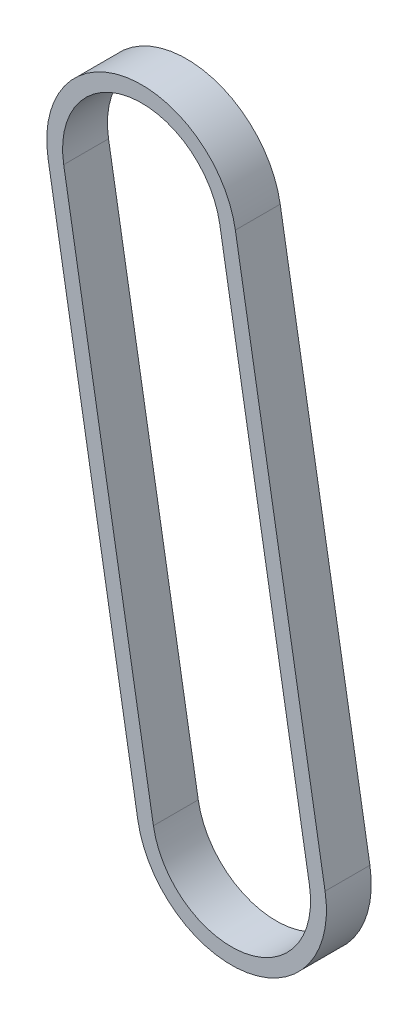
ISO-10303-21;
HEADER;
FILE_DESCRIPTION(('STEP AP214'),'2;1');
FILE_NAME('part.step','',(''),(''),'','','');
FILE_SCHEMA(('AUTOMOTIVE_DESIGN { 1 0 10303 214 1 1 1 1 }'));
ENDSEC;
DATA;
#1=APPLICATION_CONTEXT('core data for automotive mechanical design processes');
#2=APPLICATION_PROTOCOL_DEFINITION('international standard','automotive_design',2000,#1);
#3=PRODUCT_CONTEXT('',#1,'mechanical');
#4=PRODUCT('Part','Part','',(#3));
#5=PRODUCT_RELATED_PRODUCT_CATEGORY('part','',(#4));
#6=PRODUCT_DEFINITION_FORMATION('','',#4);
#7=PRODUCT_DEFINITION_CONTEXT('part definition',#1,'design');
#8=PRODUCT_DEFINITION('design','',#6,#7);
#9=PRODUCT_DEFINITION_SHAPE('','',#8);
#10=(LENGTH_UNIT() NAMED_UNIT(*) SI_UNIT(.MILLI.,.METRE.));
#11=(NAMED_UNIT(*) PLANE_ANGLE_UNIT() SI_UNIT($,.RADIAN.));
#12=(NAMED_UNIT(*) SI_UNIT($,.STERADIAN.) SOLID_ANGLE_UNIT());
#13=UNCERTAINTY_MEASURE_WITH_UNIT(LENGTH_MEASURE(1.E-05),#10,'distance_accuracy_value','');
#14=(GEOMETRIC_REPRESENTATION_CONTEXT(3) GLOBAL_UNCERTAINTY_ASSIGNED_CONTEXT((#13)) GLOBAL_UNIT_ASSIGNED_CONTEXT((#10,
#11,#12)) REPRESENTATION_CONTEXT('',''));
#15=CARTESIAN_POINT('',(0.,0.,0.));
#16=DIRECTION('',(0.,0.,1.));
#17=DIRECTION('',(1.,0.,0.));
#18=AXIS2_PLACEMENT_3D('',#15,#16,#17);
#19=CARTESIAN_POINT('',(-17.,62.590365959435,8.5));
#20=DIRECTION('',(0.,0.,1.));
#21=DIRECTION('',(1.,0.,0.));
#22=AXIS2_PLACEMENT_3D('',#19,#20,#21);
#23=PLANE('',#22);
#24=CARTESIAN_POINT('',(-17.,62.590365959435,8.5));
#25=DIRECTION('',(0.,0.,1.));
#26=DIRECTION('',(1.,0.,0.));
#27=AXIS2_PLACEMENT_3D('',#24,#25,#26);
#28=CIRCLE('',#27,18.);
#29=CARTESIAN_POINT('',(0.745405240056712,65.6070848502446,8.5));
#30=VERTEX_POINT('',#29);
#31=CARTESIAN_POINT('',(-34.7454052400567,59.5736470686253,8.5));
#32=VERTEX_POINT('',#31);
#33=EDGE_CURVE('E136',#30,#32,#28,.T.);
#34=ORIENTED_EDGE('',*,*,#33,.T.);
#35=DIRECTION('',(0.167595493933869,-0.985855846669817,0.));
#36=VECTOR('',#35,1.);
#37=CARTESIAN_POINT('',(-34.7454052400567,59.5736470686253,8.5));
#38=LINE('',#37,#36);
#39=CARTESIAN_POINT('',(-17.7454052400567,-40.4263529313747,8.5));
#40=VERTEX_POINT('',#39);
#41=EDGE_CURVE('E139',#32,#40,#38,.T.);
#42=ORIENTED_EDGE('',*,*,#41,.T.);
#43=CARTESIAN_POINT('',(0.,-37.409634040565,8.5));
#44=DIRECTION('',(0.,0.,1.));
#45=DIRECTION('',(1.,0.,0.));
#46=AXIS2_PLACEMENT_3D('',#43,#44,#45);
#47=CIRCLE('',#46,18.);
#48=CARTESIAN_POINT('',(17.7454052400567,-34.3929151497554,8.5));
#49=VERTEX_POINT('',#48);
#50=EDGE_CURVE('E142',#40,#49,#47,.T.);
#51=ORIENTED_EDGE('',*,*,#50,.T.);
#52=DIRECTION('',(-0.167595493933869,0.985855846669817,0.));
#53=VECTOR('',#52,1.);
#54=CARTESIAN_POINT('',(0.745405240056712,65.6070848502446,8.5));
#55=LINE('',#54,#53);
#56=EDGE_CURVE('E144',#49,#30,#55,.T.);
#57=ORIENTED_EDGE('',*,*,#56,.T.);
#58=EDGE_LOOP('',(#34,#42,#51,#57));
#59=FACE_BOUND('',#58,.T.);
#60=DIRECTION('',(0.167595493933869,-0.985855846669817,0.));
#61=VECTOR('',#60,1.);
#62=CARTESIAN_POINT('',(-31.7878377000473,60.076433550427,8.5));
#63=LINE('',#62,#61);
#64=CARTESIAN_POINT('',(-31.7878377000473,60.076433550427,8.5));
#65=VERTEX_POINT('',#64);
#66=CARTESIAN_POINT('',(-14.7878377000473,-39.9235664495731,8.5));
#67=VERTEX_POINT('',#66);
#68=EDGE_CURVE('E108',#65,#67,#63,.T.);
#69=ORIENTED_EDGE('',*,*,#68,.F.);
#70=CARTESIAN_POINT('',(-17.,62.590365959435,8.5));
#71=DIRECTION('',(0.,0.,1.));
#72=DIRECTION('',(1.,0.,0.));
#73=AXIS2_PLACEMENT_3D('',#70,#71,#72);
#74=CIRCLE('',#73,15.);
#75=CARTESIAN_POINT('',(-2.21216229995274,65.104298368443,8.5));
#76=VERTEX_POINT('',#75);
#77=EDGE_CURVE('E100',#76,#65,#74,.T.);
#78=ORIENTED_EDGE('',*,*,#77,.F.);
#79=DIRECTION('',(-0.167595493933869,0.985855846669817,0.));
#80=VECTOR('',#79,1.);
#81=CARTESIAN_POINT('',(-2.21216229995274,65.104298368443,8.5));
#82=LINE('',#81,#80);
#83=CARTESIAN_POINT('',(14.7878377000473,-34.895701631557,8.5));
#84=VERTEX_POINT('',#83);
#85=EDGE_CURVE('E122',#84,#76,#82,.T.);
#86=ORIENTED_EDGE('',*,*,#85,.F.);
#87=CARTESIAN_POINT('',(0.,-37.409634040565,8.5));
#88=DIRECTION('',(0.,0.,1.));
#89=DIRECTION('',(1.,0.,0.));
#90=AXIS2_PLACEMENT_3D('',#87,#88,#89);
#91=CIRCLE('',#90,15.);
#92=EDGE_CURVE('E120',#67,#84,#91,.T.);
#93=ORIENTED_EDGE('',*,*,#92,.F.);
#94=EDGE_LOOP('',(#69,#78,#86,#93));
#95=FACE_BOUND('',#94,.T.);
#96=ADVANCED_FACE('F35',(#59,#95),#23,.T.);
#97=CARTESIAN_POINT('',(-17.,62.590365959435,0.));
#98=DIRECTION('',(0.,0.,1.));
#99=DIRECTION('',(1.,0.,0.));
#100=AXIS2_PLACEMENT_3D('',#97,#98,#99);
#101=PLANE('',#100);
#102=CARTESIAN_POINT('',(-17.,62.590365959435,0.));
#103=DIRECTION('',(0.,0.,1.));
#104=DIRECTION('',(1.,0.,0.));
#105=AXIS2_PLACEMENT_3D('',#102,#103,#104);
#106=CIRCLE('',#105,18.);
#107=CARTESIAN_POINT('',(0.745405240056712,65.6070848502446,0.));
#108=VERTEX_POINT('',#107);
#109=CARTESIAN_POINT('',(-34.7454052400567,59.5736470686253,0.));
#110=VERTEX_POINT('',#109);
#111=EDGE_CURVE('E116',#108,#110,#106,.T.);
#112=ORIENTED_EDGE('',*,*,#111,.F.);
#113=DIRECTION('',(-0.167595493933869,0.985855846669817,0.));
#114=VECTOR('',#113,1.);
#115=CARTESIAN_POINT('',(0.745405240056712,65.6070848502446,0.));
#116=LINE('',#115,#114);
#117=CARTESIAN_POINT('',(17.7454052400567,-34.3929151497554,0.));
#118=VERTEX_POINT('',#117);
#119=EDGE_CURVE('E140',#118,#108,#116,.T.);
#120=ORIENTED_EDGE('',*,*,#119,.F.);
#121=CARTESIAN_POINT('',(0.,-37.409634040565,0.));
#122=DIRECTION('',(0.,0.,1.));
#123=DIRECTION('',(1.,0.,0.));
#124=AXIS2_PLACEMENT_3D('',#121,#122,#123);
#125=CIRCLE('',#124,18.);
#126=CARTESIAN_POINT('',(-17.7454052400567,-40.4263529313747,0.));
#127=VERTEX_POINT('',#126);
#128=EDGE_CURVE('E151',#127,#118,#125,.T.);
#129=ORIENTED_EDGE('',*,*,#128,.F.);
#130=DIRECTION('',(0.167595493933869,-0.985855846669817,0.));
#131=VECTOR('',#130,1.);
#132=CARTESIAN_POINT('',(-34.7454052400567,59.5736470686253,0.));
#133=LINE('',#132,#131);
#134=EDGE_CURVE('E149',#110,#127,#133,.T.);
#135=ORIENTED_EDGE('',*,*,#134,.F.);
#136=EDGE_LOOP('',(#112,#120,#129,#135));
#137=FACE_BOUND('',#136,.T.);
#138=CARTESIAN_POINT('',(-17.,62.590365959435,0.));
#139=DIRECTION('',(0.,0.,1.));
#140=DIRECTION('',(1.,0.,0.));
#141=AXIS2_PLACEMENT_3D('',#138,#139,#140);
#142=CIRCLE('',#141,15.);
#143=CARTESIAN_POINT('',(-2.21216229995274,65.104298368443,0.));
#144=VERTEX_POINT('',#143);
#145=CARTESIAN_POINT('',(-31.7878377000473,60.076433550427,0.));
#146=VERTEX_POINT('',#145);
#147=EDGE_CURVE('E58',#144,#146,#142,.T.);
#148=ORIENTED_EDGE('',*,*,#147,.T.);
#149=DIRECTION('',(0.167595493933869,-0.985855846669817,0.));
#150=VECTOR('',#149,1.);
#151=CARTESIAN_POINT('',(-31.7878377000473,60.076433550427,0.));
#152=LINE('',#151,#150);
#153=CARTESIAN_POINT('',(-14.7878377000473,-39.9235664495731,0.));
#154=VERTEX_POINT('',#153);
#155=EDGE_CURVE('E115',#146,#154,#152,.T.);
#156=ORIENTED_EDGE('',*,*,#155,.T.);
#157=CARTESIAN_POINT('',(0.,-37.409634040565,0.));
#158=DIRECTION('',(0.,0.,1.));
#159=DIRECTION('',(1.,0.,0.));
#160=AXIS2_PLACEMENT_3D('',#157,#158,#159);
#161=CIRCLE('',#160,15.);
#162=CARTESIAN_POINT('',(14.7878377000473,-34.895701631557,0.));
#163=VERTEX_POINT('',#162);
#164=EDGE_CURVE('E128',#154,#163,#161,.T.);
#165=ORIENTED_EDGE('',*,*,#164,.T.);
#166=DIRECTION('',(-0.167595493933869,0.985855846669817,0.));
#167=VECTOR('',#166,1.);
#168=CARTESIAN_POINT('',(-2.21216229995274,65.104298368443,0.));
#169=LINE('',#168,#167);
#170=EDGE_CURVE('E109',#163,#144,#169,.T.);
#171=ORIENTED_EDGE('',*,*,#170,.T.);
#172=EDGE_LOOP('',(#148,#156,#165,#171));
#173=FACE_BOUND('',#172,.T.);
#174=ADVANCED_FACE('F169',(#137,#173),#101,.F.);
#175=CARTESIAN_POINT('',(-17.,62.590365959435,8.5));
#176=DIRECTION('',(0.,0.,-1.));
#177=DIRECTION('',(-1.,0.,0.));
#178=AXIS2_PLACEMENT_3D('',#175,#176,#177);
#179=CYLINDRICAL_SURFACE('',#178,18.);
#180=ORIENTED_EDGE('',*,*,#111,.T.);
#181=DIRECTION('',(0.,0.,-1.));
#182=VECTOR('',#181,1.);
#183=CARTESIAN_POINT('',(-34.7454052400567,59.5736470686253,8.5));
#184=LINE('',#183,#182);
#185=EDGE_CURVE('E11',#32,#110,#184,.T.);
#186=ORIENTED_EDGE('',*,*,#185,.F.);
#187=ORIENTED_EDGE('',*,*,#33,.F.);
#188=DIRECTION('',(0.,0.,-1.));
#189=VECTOR('',#188,1.);
#190=CARTESIAN_POINT('',(0.745405240056712,65.6070848502446,8.5));
#191=LINE('',#190,#189);
#192=EDGE_CURVE('E146',#30,#108,#191,.T.);
#193=ORIENTED_EDGE('',*,*,#192,.T.);
#194=EDGE_LOOP('',(#180,#186,#187,#193));
#195=FACE_BOUND('',#194,.T.);
#196=ADVANCED_FACE('F37',(#195),#179,.T.);
#197=CARTESIAN_POINT('',(-34.7454052400567,59.5736470686253,8.5));
#198=DIRECTION('',(0.985855846669817,0.167595493933869,0.));
#199=DIRECTION('',(-0.167595493933869,0.985855846669818,0.));
#200=AXIS2_PLACEMENT_3D('',#197,#198,#199);
#201=PLANE('',#200);
#202=ORIENTED_EDGE('',*,*,#134,.T.);
#203=DIRECTION('',(0.,0.,-1.));
#204=VECTOR('',#203,1.);
#205=CARTESIAN_POINT('',(-17.7454052400567,-40.4263529313747,8.5));
#206=LINE('',#205,#204);
#207=EDGE_CURVE('E43',#40,#127,#206,.T.);
#208=ORIENTED_EDGE('',*,*,#207,.F.);
#209=ORIENTED_EDGE('',*,*,#41,.F.);
#210=ORIENTED_EDGE('',*,*,#185,.T.);
#211=EDGE_LOOP('',(#202,#208,#209,#210));
#212=FACE_BOUND('',#211,.T.);
#213=ADVANCED_FACE('F179',(#212),#201,.F.);
#214=CARTESIAN_POINT('',(0.,-37.409634040565,8.5));
#215=DIRECTION('',(0.,0.,-1.));
#216=DIRECTION('',(-1.,0.,0.));
#217=AXIS2_PLACEMENT_3D('',#214,#215,#216);
#218=CYLINDRICAL_SURFACE('',#217,18.);
#219=ORIENTED_EDGE('',*,*,#128,.T.);
#220=DIRECTION('',(0.,0.,-1.));
#221=VECTOR('',#220,1.);
#222=CARTESIAN_POINT('',(17.7454052400567,-34.3929151497554,8.5));
#223=LINE('',#222,#221);
#224=EDGE_CURVE('E156',#49,#118,#223,.T.);
#225=ORIENTED_EDGE('',*,*,#224,.F.);
#226=ORIENTED_EDGE('',*,*,#50,.F.);
#227=ORIENTED_EDGE('',*,*,#207,.T.);
#228=EDGE_LOOP('',(#219,#225,#226,#227));
#229=FACE_BOUND('',#228,.T.);
#230=ADVANCED_FACE('F163',(#229),#218,.T.);
#231=CARTESIAN_POINT('',(0.745405240056712,65.6070848502446,8.5));
#232=DIRECTION('',(-0.985855846669818,-0.167595493933869,0.));
#233=DIRECTION('',(0.167595493933869,-0.985855846669817,0.));
#234=AXIS2_PLACEMENT_3D('',#231,#232,#233);
#235=PLANE('',#234);
#236=ORIENTED_EDGE('',*,*,#119,.T.);
#237=ORIENTED_EDGE('',*,*,#192,.F.);
#238=ORIENTED_EDGE('',*,*,#56,.F.);
#239=ORIENTED_EDGE('',*,*,#224,.T.);
#240=EDGE_LOOP('',(#236,#237,#238,#239));
#241=FACE_BOUND('',#240,.T.);
#242=ADVANCED_FACE('F173',(#241),#235,.F.);
#243=CARTESIAN_POINT('',(-17.,62.590365959435,8.5));
#244=DIRECTION('',(0.,0.,-1.));
#245=DIRECTION('',(-1.,0.,0.));
#246=AXIS2_PLACEMENT_3D('',#243,#244,#245);
#247=CYLINDRICAL_SURFACE('',#246,15.);
#248=ORIENTED_EDGE('',*,*,#147,.F.);
#249=DIRECTION('',(0.,0.,-1.));
#250=VECTOR('',#249,1.);
#251=CARTESIAN_POINT('',(-2.21216229995274,65.104298368443,8.5));
#252=LINE('',#251,#250);
#253=EDGE_CURVE('E104',#76,#144,#252,.T.);
#254=ORIENTED_EDGE('',*,*,#253,.F.);
#255=ORIENTED_EDGE('',*,*,#77,.T.);
#256=DIRECTION('',(0.,0.,-1.));
#257=VECTOR('',#256,1.);
#258=CARTESIAN_POINT('',(-31.7878377000473,60.076433550427,8.5));
#259=LINE('',#258,#257);
#260=EDGE_CURVE('E103',#65,#146,#259,.T.);
#261=ORIENTED_EDGE('',*,*,#260,.T.);
#262=EDGE_LOOP('',(#248,#254,#255,#261));
#263=FACE_BOUND('',#262,.T.);
#264=ADVANCED_FACE('F102',(#263),#247,.F.);
#265=CARTESIAN_POINT('',(-31.7878377000473,60.076433550427,8.5));
#266=DIRECTION('',(0.985855846669818,0.167595493933869,0.));
#267=DIRECTION('',(-0.167595493933869,0.985855846669818,0.));
#268=AXIS2_PLACEMENT_3D('',#265,#266,#267);
#269=PLANE('',#268);
#270=ORIENTED_EDGE('',*,*,#155,.F.);
#271=ORIENTED_EDGE('',*,*,#260,.F.);
#272=ORIENTED_EDGE('',*,*,#68,.T.);
#273=DIRECTION('',(0.,0.,-1.));
#274=VECTOR('',#273,1.);
#275=CARTESIAN_POINT('',(-14.7878377000473,-39.9235664495731,8.5));
#276=LINE('',#275,#274);
#277=EDGE_CURVE('E117',#67,#154,#276,.T.);
#278=ORIENTED_EDGE('',*,*,#277,.T.);
#279=EDGE_LOOP('',(#270,#271,#272,#278));
#280=FACE_BOUND('',#279,.T.);
#281=ADVANCED_FACE('F112',(#280),#269,.T.);
#282=CARTESIAN_POINT('',(0.,-37.409634040565,8.5));
#283=DIRECTION('',(0.,0.,-1.));
#284=DIRECTION('',(-1.,0.,0.));
#285=AXIS2_PLACEMENT_3D('',#282,#283,#284);
#286=CYLINDRICAL_SURFACE('',#285,15.);
#287=ORIENTED_EDGE('',*,*,#164,.F.);
#288=ORIENTED_EDGE('',*,*,#277,.F.);
#289=ORIENTED_EDGE('',*,*,#92,.T.);
#290=DIRECTION('',(0.,0.,-1.));
#291=VECTOR('',#290,1.);
#292=CARTESIAN_POINT('',(14.7878377000473,-34.895701631557,8.5));
#293=LINE('',#292,#291);
#294=EDGE_CURVE('E50',#84,#163,#293,.T.);
#295=ORIENTED_EDGE('',*,*,#294,.T.);
#296=EDGE_LOOP('',(#287,#288,#289,#295));
#297=FACE_BOUND('',#296,.T.);
#298=ADVANCED_FACE('F202',(#297),#286,.F.);
#299=CARTESIAN_POINT('',(-2.21216229995274,65.104298368443,8.5));
#300=DIRECTION('',(-0.985855846669818,-0.167595493933869,0.));
#301=DIRECTION('',(0.167595493933869,-0.985855846669818,0.));
#302=AXIS2_PLACEMENT_3D('',#299,#300,#301);
#303=PLANE('',#302);
#304=ORIENTED_EDGE('',*,*,#170,.F.);
#305=ORIENTED_EDGE('',*,*,#294,.F.);
#306=ORIENTED_EDGE('',*,*,#85,.T.);
#307=ORIENTED_EDGE('',*,*,#253,.T.);
#308=EDGE_LOOP('',(#304,#305,#306,#307));
#309=FACE_BOUND('',#308,.T.);
#310=ADVANCED_FACE('F206',(#309),#303,.T.);
#311=CLOSED_SHELL('',(#96,#174,#196,#213,#230,#242,#264,#281,#298,#310));
#312=MANIFOLD_SOLID_BREP('B2',#311);
#313=ADVANCED_BREP_SHAPE_REPRESENTATION('',(#18,#312),#14);
#314=SHAPE_DEFINITION_REPRESENTATION(#9,#313);
ENDSEC;
END-ISO-10303-21;
